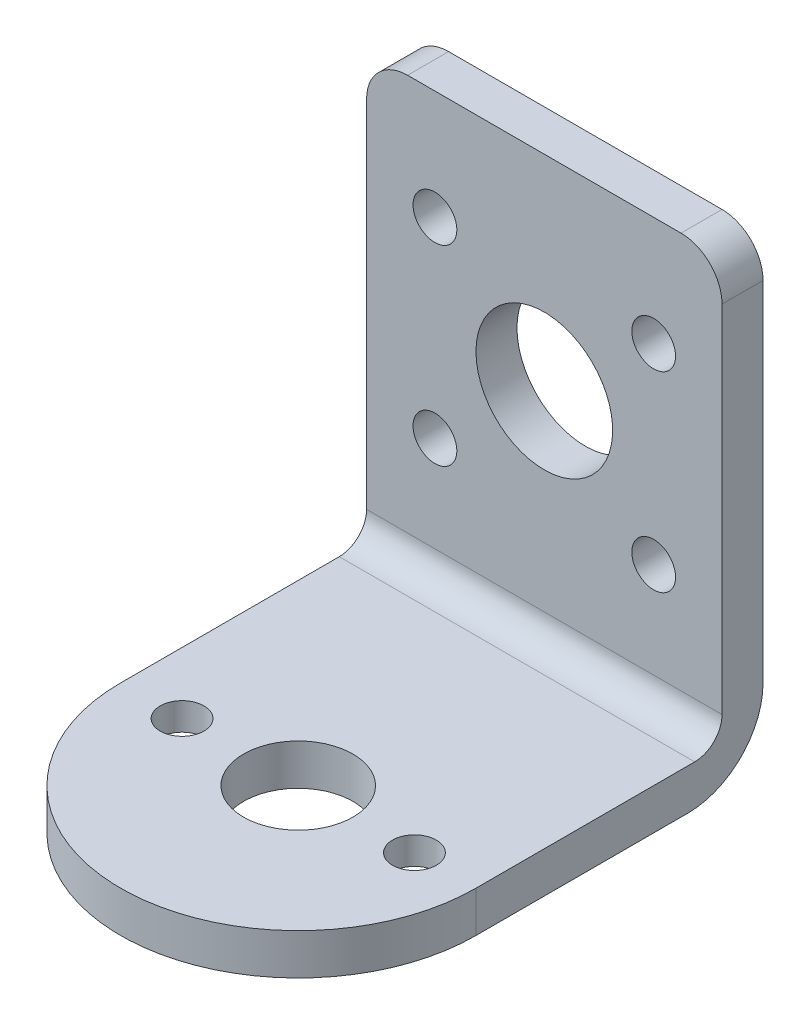
ISO-10303-21;
HEADER;
FILE_DESCRIPTION(('STEP AP214'),'2;1');
FILE_NAME('part.step','',(''),(''),'','','');
FILE_SCHEMA(('AUTOMOTIVE_DESIGN { 1 0 10303 214 1 1 1 1 }'));
ENDSEC;
DATA;
#1=APPLICATION_CONTEXT('core data for automotive mechanical design processes');
#2=APPLICATION_PROTOCOL_DEFINITION('international standard','automotive_design',2000,#1);
#3=PRODUCT_CONTEXT('',#1,'mechanical');
#4=PRODUCT('Part','Part','',(#3));
#5=PRODUCT_RELATED_PRODUCT_CATEGORY('part','',(#4));
#6=PRODUCT_DEFINITION_FORMATION('','',#4);
#7=PRODUCT_DEFINITION_CONTEXT('part definition',#1,'design');
#8=PRODUCT_DEFINITION('design','',#6,#7);
#9=PRODUCT_DEFINITION_SHAPE('','',#8);
#10=(LENGTH_UNIT() NAMED_UNIT(*) SI_UNIT(.MILLI.,.METRE.));
#11=(NAMED_UNIT(*) PLANE_ANGLE_UNIT() SI_UNIT($,.RADIAN.));
#12=(NAMED_UNIT(*) SI_UNIT($,.STERADIAN.) SOLID_ANGLE_UNIT());
#13=UNCERTAINTY_MEASURE_WITH_UNIT(LENGTH_MEASURE(1.E-05),#10,'distance_accuracy_value','');
#14=(GEOMETRIC_REPRESENTATION_CONTEXT(3) GLOBAL_UNCERTAINTY_ASSIGNED_CONTEXT((#13)) GLOBAL_UNIT_ASSIGNED_CONTEXT((#10,
#11,#12)) REPRESENTATION_CONTEXT('',''));
#15=CARTESIAN_POINT('',(0.,0.,0.));
#16=DIRECTION('',(0.,0.,1.));
#17=DIRECTION('',(1.,0.,0.));
#18=AXIS2_PLACEMENT_3D('',#15,#16,#17);
#19=CARTESIAN_POINT('',(0.,3.,0.));
#20=DIRECTION('',(0.,-1.,0.));
#21=DIRECTION('',(0.,0.,-1.));
#22=AXIS2_PLACEMENT_3D('',#19,#20,#21);
#23=CYLINDRICAL_SURFACE('',#22,13.);
#24=CARTESIAN_POINT('',(0.,0.,0.));
#25=DIRECTION('',(0.,1.,0.));
#26=DIRECTION('',(0.,0.,1.));
#27=AXIS2_PLACEMENT_3D('',#24,#25,#26);
#28=CIRCLE('',#27,13.);
#29=CARTESIAN_POINT('',(-13.,0.,0.));
#30=VERTEX_POINT('',#29);
#31=CARTESIAN_POINT('',(13.,0.,0.));
#32=VERTEX_POINT('',#31);
#33=EDGE_CURVE('E152',#30,#32,#28,.T.);
#34=ORIENTED_EDGE('',*,*,#33,.T.);
#35=DIRECTION('',(0.,-1.,0.));
#36=VECTOR('',#35,1.);
#37=CARTESIAN_POINT('',(13.,3.,0.));
#38=LINE('',#37,#36);
#39=CARTESIAN_POINT('',(13.,3.,0.));
#40=VERTEX_POINT('',#39);
#41=EDGE_CURVE('E132',#40,#32,#38,.T.);
#42=ORIENTED_EDGE('',*,*,#41,.F.);
#43=CARTESIAN_POINT('',(0.,3.,0.));
#44=DIRECTION('',(0.,1.,0.));
#45=DIRECTION('',(0.,0.,1.));
#46=AXIS2_PLACEMENT_3D('',#43,#44,#45);
#47=CIRCLE('',#46,13.);
#48=CARTESIAN_POINT('',(-13.,3.,0.));
#49=VERTEX_POINT('',#48);
#50=EDGE_CURVE('E140',#49,#40,#47,.T.);
#51=ORIENTED_EDGE('',*,*,#50,.F.);
#52=DIRECTION('',(0.,-1.,0.));
#53=VECTOR('',#52,1.);
#54=CARTESIAN_POINT('',(-13.,3.,0.));
#55=LINE('',#54,#53);
#56=EDGE_CURVE('E286',#49,#30,#55,.T.);
#57=ORIENTED_EDGE('',*,*,#56,.T.);
#58=EDGE_LOOP('',(#34,#42,#51,#57));
#59=FACE_BOUND('',#58,.T.);
#60=ADVANCED_FACE('F47',(#59),#23,.T.);
#61=CARTESIAN_POINT('',(13.,3.,0.));
#62=DIRECTION('',(-1.,0.,0.));
#63=DIRECTION('',(0.,0.,1.));
#64=AXIS2_PLACEMENT_3D('',#61,#62,#63);
#65=PLANE('',#64);
#66=DIRECTION('',(0.,-1.,0.));
#67=VECTOR('',#66,1.);
#68=CARTESIAN_POINT('',(13.,3.,-21.));
#69=LINE('',#68,#67);
#70=CARTESIAN_POINT('',(13.,31.,-21.));
#71=VERTEX_POINT('',#70);
#72=CARTESIAN_POINT('',(13.,5.5,-21.));
#73=VERTEX_POINT('',#72);
#74=EDGE_CURVE('E155',#71,#73,#69,.T.);
#75=ORIENTED_EDGE('',*,*,#74,.F.);
#76=DIRECTION('',(0.,0.,-1.));
#77=VECTOR('',#76,1.);
#78=CARTESIAN_POINT('',(13.,31.,-18.));
#79=LINE('',#78,#77);
#80=CARTESIAN_POINT('',(13.,31.,-18.));
#81=VERTEX_POINT('',#80);
#82=EDGE_CURVE('E237',#71,#81,#79,.F.);
#83=ORIENTED_EDGE('',*,*,#82,.T.);
#84=DIRECTION('',(0.,-1.,0.));
#85=VECTOR('',#84,1.);
#86=CARTESIAN_POINT('',(13.,34.,-18.));
#87=LINE('',#86,#85);
#88=CARTESIAN_POINT('',(13.,5.,-18.));
#89=VERTEX_POINT('',#88);
#90=EDGE_CURVE('E337',#81,#89,#87,.T.);
#91=ORIENTED_EDGE('',*,*,#90,.T.);
#92=CARTESIAN_POINT('',(13.,5.,-16.));
#93=DIRECTION('',(-1.,0.,0.));
#94=DIRECTION('',(0.,0.,1.));
#95=AXIS2_PLACEMENT_3D('',#92,#93,#94);
#96=CIRCLE('',#95,2.);
#97=CARTESIAN_POINT('',(13.,3.,-16.));
#98=VERTEX_POINT('',#97);
#99=EDGE_CURVE('E135',#89,#98,#96,.T.);
#100=ORIENTED_EDGE('',*,*,#99,.T.);
#101=DIRECTION('',(0.,0.,-1.));
#102=VECTOR('',#101,1.);
#103=CARTESIAN_POINT('',(13.,3.,0.));
#104=LINE('',#103,#102);
#105=EDGE_CURVE('E127',#40,#98,#104,.T.);
#106=ORIENTED_EDGE('',*,*,#105,.F.);
#107=ORIENTED_EDGE('',*,*,#41,.T.);
#108=DIRECTION('',(0.,0.,-1.));
#109=VECTOR('',#108,1.);
#110=CARTESIAN_POINT('',(13.,0.,0.));
#111=LINE('',#110,#109);
#112=CARTESIAN_POINT('',(13.,0.,-15.5));
#113=VERTEX_POINT('',#112);
#114=EDGE_CURVE('E273',#32,#113,#111,.T.);
#115=ORIENTED_EDGE('',*,*,#114,.T.);
#116=CARTESIAN_POINT('',(13.,5.5,-15.5));
#117=DIRECTION('',(-1.,0.,0.));
#118=DIRECTION('',(0.,0.,1.));
#119=AXIS2_PLACEMENT_3D('',#116,#117,#118);
#120=CIRCLE('',#119,5.5);
#121=EDGE_CURVE('E183',#113,#73,#120,.F.);
#122=ORIENTED_EDGE('',*,*,#121,.T.);
#123=EDGE_LOOP('',(#75,#83,#91,#100,#106,#107,#115,#122));
#124=FACE_BOUND('',#123,.T.);
#125=ADVANCED_FACE('F129',(#124),#65,.F.);
#126=CARTESIAN_POINT('',(0.,3.,-21.));
#127=DIRECTION('',(0.,0.,-1.));
#128=DIRECTION('',(-1.,0.,0.));
#129=AXIS2_PLACEMENT_3D('',#126,#127,#128);
#130=PLANE('',#129);
#131=CARTESIAN_POINT('',(-8.,12.,-21.));
#132=DIRECTION('',(0.,0.,-1.));
#133=DIRECTION('',(-1.,0.,0.));
#134=AXIS2_PLACEMENT_3D('',#131,#132,#133);
#135=CIRCLE('',#134,1.6);
#136=CARTESIAN_POINT('',(-9.6,12.,-21.));
#137=VERTEX_POINT('',#136);
#138=EDGE_CURVE('E430',#137,#137,#135,.T.);
#139=ORIENTED_EDGE('',*,*,#138,.F.);
#140=EDGE_LOOP('',(#139));
#141=FACE_BOUND('',#140,.T.);
#142=CARTESIAN_POINT('',(8.,12.,-21.));
#143=DIRECTION('',(0.,0.,-1.));
#144=DIRECTION('',(-1.,0.,0.));
#145=AXIS2_PLACEMENT_3D('',#142,#143,#144);
#146=CIRCLE('',#145,1.6);
#147=CARTESIAN_POINT('',(6.4,12.,-21.));
#148=VERTEX_POINT('',#147);
#149=EDGE_CURVE('E425',#148,#148,#146,.T.);
#150=ORIENTED_EDGE('',*,*,#149,.F.);
#151=EDGE_LOOP('',(#150));
#152=FACE_BOUND('',#151,.T.);
#153=CARTESIAN_POINT('',(-8.,26.,-21.));
#154=DIRECTION('',(0.,0.,-1.));
#155=DIRECTION('',(-1.,0.,0.));
#156=AXIS2_PLACEMENT_3D('',#153,#154,#155);
#157=CIRCLE('',#156,1.6);
#158=CARTESIAN_POINT('',(-9.6,26.,-21.));
#159=VERTEX_POINT('',#158);
#160=EDGE_CURVE('E419',#159,#159,#157,.T.);
#161=ORIENTED_EDGE('',*,*,#160,.F.);
#162=EDGE_LOOP('',(#161));
#163=FACE_BOUND('',#162,.T.);
#164=CARTESIAN_POINT('',(8.,26.,-21.));
#165=DIRECTION('',(0.,0.,-1.));
#166=DIRECTION('',(-1.,0.,0.));
#167=AXIS2_PLACEMENT_3D('',#164,#165,#166);
#168=CIRCLE('',#167,1.6);
#169=CARTESIAN_POINT('',(6.4,26.,-21.));
#170=VERTEX_POINT('',#169);
#171=EDGE_CURVE('E411',#170,#170,#168,.T.);
#172=ORIENTED_EDGE('',*,*,#171,.F.);
#173=EDGE_LOOP('',(#172));
#174=FACE_BOUND('',#173,.T.);
#175=CARTESIAN_POINT('',(0.,19.,-21.));
#176=DIRECTION('',(0.,0.,-1.));
#177=DIRECTION('',(-1.,0.,0.));
#178=AXIS2_PLACEMENT_3D('',#175,#176,#177);
#179=CIRCLE('',#178,5.);
#180=CARTESIAN_POINT('',(-5.,19.,-21.));
#181=VERTEX_POINT('',#180);
#182=EDGE_CURVE('E200',#181,#181,#179,.T.);
#183=ORIENTED_EDGE('',*,*,#182,.F.);
#184=EDGE_LOOP('',(#183));
#185=FACE_BOUND('',#184,.T.);
#186=DIRECTION('',(0.,-1.,0.));
#187=VECTOR('',#186,1.);
#188=CARTESIAN_POINT('',(-13.,3.,-21.));
#189=LINE('',#188,#187);
#190=CARTESIAN_POINT('',(-13.,31.,-21.));
#191=VERTEX_POINT('',#190);
#192=CARTESIAN_POINT('',(-13.,5.5,-21.));
#193=VERTEX_POINT('',#192);
#194=EDGE_CURVE('E162',#191,#193,#189,.T.);
#195=ORIENTED_EDGE('',*,*,#194,.F.);
#196=CARTESIAN_POINT('',(-10.,31.,-21.));
#197=DIRECTION('',(0.,0.,-1.));
#198=DIRECTION('',(-1.,0.,0.));
#199=AXIS2_PLACEMENT_3D('',#196,#197,#198);
#200=CIRCLE('',#199,3.);
#201=CARTESIAN_POINT('',(-10.,34.,-21.));
#202=VERTEX_POINT('',#201);
#203=EDGE_CURVE('E234',#191,#202,#200,.T.);
#204=ORIENTED_EDGE('',*,*,#203,.T.);
#205=DIRECTION('',(-1.,0.,0.));
#206=VECTOR('',#205,1.);
#207=CARTESIAN_POINT('',(-13.,34.,-21.));
#208=LINE('',#207,#206);
#209=CARTESIAN_POINT('',(10.,34.,-21.));
#210=VERTEX_POINT('',#209);
#211=EDGE_CURVE('E342',#210,#202,#208,.T.);
#212=ORIENTED_EDGE('',*,*,#211,.F.);
#213=CARTESIAN_POINT('',(10.,31.,-21.));
#214=DIRECTION('',(0.,0.,-1.));
#215=DIRECTION('',(-1.,0.,0.));
#216=AXIS2_PLACEMENT_3D('',#213,#214,#215);
#217=CIRCLE('',#216,3.);
#218=EDGE_CURVE('E64',#210,#71,#217,.T.);
#219=ORIENTED_EDGE('',*,*,#218,.T.);
#220=ORIENTED_EDGE('',*,*,#74,.T.);
#221=DIRECTION('',(1.,0.,0.));
#222=VECTOR('',#221,1.);
#223=CARTESIAN_POINT('',(-13.,5.5,-21.));
#224=LINE('',#223,#222);
#225=EDGE_CURVE('E187',#73,#193,#224,.F.);
#226=ORIENTED_EDGE('',*,*,#225,.T.);
#227=EDGE_LOOP('',(#195,#204,#212,#219,#220,#226));
#228=FACE_BOUND('',#227,.T.);
#229=ADVANCED_FACE('F291',(#141,#152,#163,#174,#185,#228),#130,.T.);
#230=CARTESIAN_POINT('',(-13.,3.,0.));
#231=DIRECTION('',(-1.,0.,0.));
#232=DIRECTION('',(0.,0.,1.));
#233=AXIS2_PLACEMENT_3D('',#230,#231,#232);
#234=PLANE('',#233);
#235=DIRECTION('',(0.,-1.,0.));
#236=VECTOR('',#235,1.);
#237=CARTESIAN_POINT('',(-13.,34.,-18.));
#238=LINE('',#237,#236);
#239=CARTESIAN_POINT('',(-13.,31.,-18.));
#240=VERTEX_POINT('',#239);
#241=CARTESIAN_POINT('',(-13.,5.,-18.));
#242=VERTEX_POINT('',#241);
#243=EDGE_CURVE('E351',#240,#242,#238,.T.);
#244=ORIENTED_EDGE('',*,*,#243,.F.);
#245=DIRECTION('',(0.,0.,1.));
#246=VECTOR('',#245,1.);
#247=CARTESIAN_POINT('',(-13.,31.,0.));
#248=LINE('',#247,#246);
#249=EDGE_CURVE('E72',#240,#191,#248,.F.);
#250=ORIENTED_EDGE('',*,*,#249,.T.);
#251=ORIENTED_EDGE('',*,*,#194,.T.);
#252=CARTESIAN_POINT('',(-13.,5.5,-15.5));
#253=DIRECTION('',(-1.,0.,0.));
#254=DIRECTION('',(0.,0.,1.));
#255=AXIS2_PLACEMENT_3D('',#252,#253,#254);
#256=CIRCLE('',#255,5.5);
#257=CARTESIAN_POINT('',(-13.,0.,-15.5));
#258=VERTEX_POINT('',#257);
#259=EDGE_CURVE('E191',#193,#258,#256,.T.);
#260=ORIENTED_EDGE('',*,*,#259,.T.);
#261=DIRECTION('',(0.,0.,-1.));
#262=VECTOR('',#261,1.);
#263=CARTESIAN_POINT('',(-13.,0.,0.));
#264=LINE('',#263,#262);
#265=EDGE_CURVE('E149',#30,#258,#264,.T.);
#266=ORIENTED_EDGE('',*,*,#265,.F.);
#267=ORIENTED_EDGE('',*,*,#56,.F.);
#268=DIRECTION('',(0.,0.,-1.));
#269=VECTOR('',#268,1.);
#270=CARTESIAN_POINT('',(-13.,3.,0.));
#271=LINE('',#270,#269);
#272=CARTESIAN_POINT('',(-13.,3.,-16.));
#273=VERTEX_POINT('',#272);
#274=EDGE_CURVE('E139',#49,#273,#271,.T.);
#275=ORIENTED_EDGE('',*,*,#274,.T.);
#276=CARTESIAN_POINT('',(-13.,5.,-16.));
#277=DIRECTION('',(-1.,0.,0.));
#278=DIRECTION('',(0.,0.,1.));
#279=AXIS2_PLACEMENT_3D('',#276,#277,#278);
#280=CIRCLE('',#279,2.);
#281=EDGE_CURVE('E175',#273,#242,#280,.F.);
#282=ORIENTED_EDGE('',*,*,#281,.T.);
#283=EDGE_LOOP('',(#244,#250,#251,#260,#266,#267,#275,#282));
#284=FACE_BOUND('',#283,.T.);
#285=ADVANCED_FACE('F289',(#284),#234,.T.);
#286=CARTESIAN_POINT('',(0.,3.,0.));
#287=DIRECTION('',(0.,1.,0.));
#288=DIRECTION('',(0.,0.,1.));
#289=AXIS2_PLACEMENT_3D('',#286,#287,#288);
#290=PLANE('',#289);
#291=ORIENTED_EDGE('',*,*,#105,.T.);
#292=DIRECTION('',(1.,0.,0.));
#293=VECTOR('',#292,1.);
#294=CARTESIAN_POINT('',(0.,3.,-16.));
#295=LINE('',#294,#293);
#296=EDGE_CURVE('E160',#98,#273,#295,.F.);
#297=ORIENTED_EDGE('',*,*,#296,.T.);
#298=ORIENTED_EDGE('',*,*,#274,.F.);
#299=ORIENTED_EDGE('',*,*,#50,.T.);
#300=EDGE_LOOP('',(#291,#297,#298,#299));
#301=FACE_BOUND('',#300,.T.);
#302=CARTESIAN_POINT('',(8.5,3.,0.));
#303=DIRECTION('',(0.,1.,0.));
#304=DIRECTION('',(0.,0.,1.));
#305=AXIS2_PLACEMENT_3D('',#302,#303,#304);
#306=CIRCLE('',#305,1.6);
#307=CARTESIAN_POINT('',(8.5,3.,1.6));
#308=VERTEX_POINT('',#307);
#309=EDGE_CURVE('E354',#308,#308,#306,.T.);
#310=ORIENTED_EDGE('',*,*,#309,.F.);
#311=EDGE_LOOP('',(#310));
#312=FACE_BOUND('',#311,.T.);
#313=CARTESIAN_POINT('',(-8.5,3.,0.));
#314=DIRECTION('',(0.,1.,0.));
#315=DIRECTION('',(0.,0.,1.));
#316=AXIS2_PLACEMENT_3D('',#313,#314,#315);
#317=CIRCLE('',#316,1.6);
#318=CARTESIAN_POINT('',(-8.5,3.,1.6));
#319=VERTEX_POINT('',#318);
#320=EDGE_CURVE('E355',#319,#319,#317,.T.);
#321=ORIENTED_EDGE('',*,*,#320,.F.);
#322=EDGE_LOOP('',(#321));
#323=FACE_BOUND('',#322,.T.);
#324=CARTESIAN_POINT('',(0.,3.,0.));
#325=DIRECTION('',(0.,1.,0.));
#326=DIRECTION('',(0.,0.,1.));
#327=AXIS2_PLACEMENT_3D('',#324,#325,#326);
#328=CIRCLE('',#327,4.);
#329=CARTESIAN_POINT('',(0.,3.,4.));
#330=VERTEX_POINT('',#329);
#331=EDGE_CURVE('E169',#330,#330,#328,.T.);
#332=ORIENTED_EDGE('',*,*,#331,.F.);
#333=EDGE_LOOP('',(#332));
#334=FACE_BOUND('',#333,.T.);
#335=ADVANCED_FACE('F144',(#301,#312,#323,#334),#290,.T.);
#336=CARTESIAN_POINT('',(0.,0.,0.));
#337=DIRECTION('',(0.,1.,0.));
#338=DIRECTION('',(0.,0.,1.));
#339=AXIS2_PLACEMENT_3D('',#336,#337,#338);
#340=PLANE('',#339);
#341=CARTESIAN_POINT('',(-8.5,0.,0.));
#342=DIRECTION('',(0.,1.,0.));
#343=DIRECTION('',(0.,0.,1.));
#344=AXIS2_PLACEMENT_3D('',#341,#342,#343);
#345=CIRCLE('',#344,3.33205080756889);
#346=CARTESIAN_POINT('',(-8.5,0.,3.33205080756889));
#347=VERTEX_POINT('',#346);
#348=EDGE_CURVE('E244',#347,#347,#345,.T.);
#349=ORIENTED_EDGE('',*,*,#348,.T.);
#350=EDGE_LOOP('',(#349));
#351=FACE_BOUND('',#350,.T.);
#352=CARTESIAN_POINT('',(8.5,0.,0.));
#353=DIRECTION('',(0.,1.,0.));
#354=DIRECTION('',(0.,0.,1.));
#355=AXIS2_PLACEMENT_3D('',#352,#353,#354);
#356=CIRCLE('',#355,3.33205080756889);
#357=CARTESIAN_POINT('',(8.5,0.,3.33205080756889));
#358=VERTEX_POINT('',#357);
#359=EDGE_CURVE('E240',#358,#358,#356,.T.);
#360=ORIENTED_EDGE('',*,*,#359,.T.);
#361=EDGE_LOOP('',(#360));
#362=FACE_BOUND('',#361,.T.);
#363=CARTESIAN_POINT('',(0.,0.,0.));
#364=DIRECTION('',(0.,1.,0.));
#365=DIRECTION('',(0.,0.,1.));
#366=AXIS2_PLACEMENT_3D('',#363,#364,#365);
#367=CIRCLE('',#366,4.);
#368=CARTESIAN_POINT('',(0.,0.,4.));
#369=VERTEX_POINT('',#368);
#370=EDGE_CURVE('E166',#369,#369,#367,.T.);
#371=ORIENTED_EDGE('',*,*,#370,.T.);
#372=EDGE_LOOP('',(#371));
#373=FACE_BOUND('',#372,.T.);
#374=ORIENTED_EDGE('',*,*,#265,.T.);
#375=DIRECTION('',(1.,0.,0.));
#376=VECTOR('',#375,1.);
#377=CARTESIAN_POINT('',(13.,0.,-15.5));
#378=LINE('',#377,#376);
#379=EDGE_CURVE('E179',#258,#113,#378,.T.);
#380=ORIENTED_EDGE('',*,*,#379,.T.);
#381=ORIENTED_EDGE('',*,*,#114,.F.);
#382=ORIENTED_EDGE('',*,*,#33,.F.);
#383=EDGE_LOOP('',(#374,#380,#381,#382));
#384=FACE_BOUND('',#383,.T.);
#385=ADVANCED_FACE('F260',(#351,#362,#373,#384),#340,.F.);
#386=CARTESIAN_POINT('',(0.,-2.,0.));
#387=DIRECTION('',(0.,1.,0.));
#388=DIRECTION('',(0.,0.,1.));
#389=AXIS2_PLACEMENT_3D('',#386,#387,#388);
#390=CYLINDRICAL_SURFACE('',#389,4.);
#391=ORIENTED_EDGE('',*,*,#331,.T.);
#392=EDGE_LOOP('',(#391));
#393=FACE_BOUND('',#392,.T.);
#394=ORIENTED_EDGE('',*,*,#370,.F.);
#395=EDGE_LOOP('',(#394));
#396=FACE_BOUND('',#395,.T.);
#397=ADVANCED_FACE('F263',(#393,#396),#390,.F.);
#398=CARTESIAN_POINT('',(-8.5,-2.,0.));
#399=DIRECTION('',(0.,1.,0.));
#400=DIRECTION('',(0.,0.,1.));
#401=AXIS2_PLACEMENT_3D('',#398,#399,#400);
#402=CYLINDRICAL_SURFACE('',#401,1.6);
#403=CARTESIAN_POINT('',(-8.5,1.00000000000001,0.));
#404=DIRECTION('',(0.,1.,0.));
#405=DIRECTION('',(0.,0.,1.));
#406=AXIS2_PLACEMENT_3D('',#403,#404,#405);
#407=CIRCLE('',#406,1.6);
#408=CARTESIAN_POINT('',(-8.5,1.00000000000001,1.6));
#409=VERTEX_POINT('',#408);
#410=EDGE_CURVE('E57',#409,#409,#407,.F.);
#411=ORIENTED_EDGE('',*,*,#410,.T.);
#412=EDGE_LOOP('',(#411));
#413=FACE_BOUND('',#412,.T.);
#414=ORIENTED_EDGE('',*,*,#320,.T.);
#415=EDGE_LOOP('',(#414));
#416=FACE_BOUND('',#415,.T.);
#417=ADVANCED_FACE('F251',(#413,#416),#402,.F.);
#418=CARTESIAN_POINT('',(8.5,-2.,0.));
#419=DIRECTION('',(0.,1.,0.));
#420=DIRECTION('',(0.,0.,1.));
#421=AXIS2_PLACEMENT_3D('',#418,#419,#420);
#422=CYLINDRICAL_SURFACE('',#421,1.6);
#423=CARTESIAN_POINT('',(8.5,1.00000000000001,0.));
#424=DIRECTION('',(0.,1.,0.));
#425=DIRECTION('',(0.,0.,1.));
#426=AXIS2_PLACEMENT_3D('',#423,#424,#425);
#427=CIRCLE('',#426,1.6);
#428=CARTESIAN_POINT('',(8.5,1.00000000000001,1.6));
#429=VERTEX_POINT('',#428);
#430=EDGE_CURVE('E11',#429,#429,#427,.F.);
#431=ORIENTED_EDGE('',*,*,#430,.T.);
#432=EDGE_LOOP('',(#431));
#433=FACE_BOUND('',#432,.T.);
#434=ORIENTED_EDGE('',*,*,#309,.T.);
#435=EDGE_LOOP('',(#434));
#436=FACE_BOUND('',#435,.T.);
#437=ADVANCED_FACE('F378',(#433,#436),#422,.F.);
#438=CARTESIAN_POINT('',(-13.,34.,-18.));
#439=DIRECTION('',(0.,0.,-1.));
#440=DIRECTION('',(-1.,0.,0.));
#441=AXIS2_PLACEMENT_3D('',#438,#439,#440);
#442=PLANE('',#441);
#443=CARTESIAN_POINT('',(-8.,12.,-18.));
#444=DIRECTION('',(0.,0.,-1.));
#445=DIRECTION('',(-1.,0.,0.));
#446=AXIS2_PLACEMENT_3D('',#443,#444,#445);
#447=CIRCLE('',#446,1.6);
#448=CARTESIAN_POINT('',(-9.6,12.,-18.));
#449=VERTEX_POINT('',#448);
#450=EDGE_CURVE('E212',#449,#449,#447,.T.);
#451=ORIENTED_EDGE('',*,*,#450,.T.);
#452=EDGE_LOOP('',(#451));
#453=FACE_BOUND('',#452,.T.);
#454=CARTESIAN_POINT('',(8.,12.,-18.));
#455=DIRECTION('',(0.,0.,-1.));
#456=DIRECTION('',(-1.,0.,0.));
#457=AXIS2_PLACEMENT_3D('',#454,#455,#456);
#458=CIRCLE('',#457,1.6);
#459=CARTESIAN_POINT('',(6.4,12.,-18.));
#460=VERTEX_POINT('',#459);
#461=EDGE_CURVE('E208',#460,#460,#458,.T.);
#462=ORIENTED_EDGE('',*,*,#461,.T.);
#463=EDGE_LOOP('',(#462));
#464=FACE_BOUND('',#463,.T.);
#465=CARTESIAN_POINT('',(-8.,26.,-18.));
#466=DIRECTION('',(0.,0.,-1.));
#467=DIRECTION('',(-1.,0.,0.));
#468=AXIS2_PLACEMENT_3D('',#465,#466,#467);
#469=CIRCLE('',#468,1.6);
#470=CARTESIAN_POINT('',(-9.6,26.,-18.));
#471=VERTEX_POINT('',#470);
#472=EDGE_CURVE('E204',#471,#471,#469,.T.);
#473=ORIENTED_EDGE('',*,*,#472,.T.);
#474=EDGE_LOOP('',(#473));
#475=FACE_BOUND('',#474,.T.);
#476=CARTESIAN_POINT('',(8.,26.,-18.));
#477=DIRECTION('',(0.,0.,-1.));
#478=DIRECTION('',(-1.,0.,0.));
#479=AXIS2_PLACEMENT_3D('',#476,#477,#478);
#480=CIRCLE('',#479,1.6);
#481=CARTESIAN_POINT('',(6.4,26.,-18.));
#482=VERTEX_POINT('',#481);
#483=EDGE_CURVE('E199',#482,#482,#480,.T.);
#484=ORIENTED_EDGE('',*,*,#483,.T.);
#485=EDGE_LOOP('',(#484));
#486=FACE_BOUND('',#485,.T.);
#487=CARTESIAN_POINT('',(0.,19.,-18.));
#488=DIRECTION('',(0.,0.,-1.));
#489=DIRECTION('',(-1.,0.,0.));
#490=AXIS2_PLACEMENT_3D('',#487,#488,#489);
#491=CIRCLE('',#490,5.);
#492=CARTESIAN_POINT('',(-5.,19.,-18.));
#493=VERTEX_POINT('',#492);
#494=EDGE_CURVE('E195',#493,#493,#491,.T.);
#495=ORIENTED_EDGE('',*,*,#494,.T.);
#496=EDGE_LOOP('',(#495));
#497=FACE_BOUND('',#496,.T.);
#498=DIRECTION('',(1.,0.,0.));
#499=VECTOR('',#498,1.);
#500=CARTESIAN_POINT('',(-13.,34.,-18.));
#501=LINE('',#500,#499);
#502=CARTESIAN_POINT('',(-10.,34.,-18.));
#503=VERTEX_POINT('',#502);
#504=CARTESIAN_POINT('',(10.,34.,-18.));
#505=VERTEX_POINT('',#504);
#506=EDGE_CURVE('E216',#503,#505,#501,.T.);
#507=ORIENTED_EDGE('',*,*,#506,.F.);
#508=CARTESIAN_POINT('',(-10.,31.,-18.));
#509=DIRECTION('',(0.,0.,-1.));
#510=DIRECTION('',(-1.,0.,0.));
#511=AXIS2_PLACEMENT_3D('',#508,#509,#510);
#512=CIRCLE('',#511,3.);
#513=EDGE_CURVE('E227',#503,#240,#512,.F.);
#514=ORIENTED_EDGE('',*,*,#513,.T.);
#515=ORIENTED_EDGE('',*,*,#243,.T.);
#516=DIRECTION('',(1.,0.,0.));
#517=VECTOR('',#516,1.);
#518=CARTESIAN_POINT('',(-13.,5.,-18.));
#519=LINE('',#518,#517);
#520=EDGE_CURVE('E154',#242,#89,#519,.T.);
#521=ORIENTED_EDGE('',*,*,#520,.T.);
#522=ORIENTED_EDGE('',*,*,#90,.F.);
#523=CARTESIAN_POINT('',(10.,31.,-18.));
#524=DIRECTION('',(0.,0.,-1.));
#525=DIRECTION('',(-1.,0.,0.));
#526=AXIS2_PLACEMENT_3D('',#523,#524,#525);
#527=CIRCLE('',#526,3.);
#528=EDGE_CURVE('E224',#81,#505,#527,.F.);
#529=ORIENTED_EDGE('',*,*,#528,.T.);
#530=EDGE_LOOP('',(#507,#514,#515,#521,#522,#529));
#531=FACE_BOUND('',#530,.T.);
#532=ADVANCED_FACE('F336',(#453,#464,#475,#486,#497,#531),#442,.F.);
#533=CARTESIAN_POINT('',(0.,34.,0.));
#534=DIRECTION('',(0.,1.,0.));
#535=DIRECTION('',(0.,0.,1.));
#536=AXIS2_PLACEMENT_3D('',#533,#534,#535);
#537=PLANE('',#536);
#538=ORIENTED_EDGE('',*,*,#211,.T.);
#539=DIRECTION('',(0.,0.,1.));
#540=VECTOR('',#539,1.);
#541=CARTESIAN_POINT('',(-10.,34.,0.));
#542=LINE('',#541,#540);
#543=EDGE_CURVE('E220',#202,#503,#542,.T.);
#544=ORIENTED_EDGE('',*,*,#543,.T.);
#545=ORIENTED_EDGE('',*,*,#506,.T.);
#546=DIRECTION('',(0.,0.,-1.));
#547=VECTOR('',#546,1.);
#548=CARTESIAN_POINT('',(10.,34.,-21.));
#549=LINE('',#548,#547);
#550=EDGE_CURVE('E194',#505,#210,#549,.T.);
#551=ORIENTED_EDGE('',*,*,#550,.T.);
#552=EDGE_LOOP('',(#538,#544,#545,#551));
#553=FACE_BOUND('',#552,.T.);
#554=ADVANCED_FACE('F311',(#553),#537,.T.);
#555=CARTESIAN_POINT('',(-13.,5.,-16.));
#556=DIRECTION('',(1.,0.,0.));
#557=DIRECTION('',(0.,0.,-1.));
#558=AXIS2_PLACEMENT_3D('',#555,#556,#557);
#559=CYLINDRICAL_SURFACE('',#558,2.);
#560=ORIENTED_EDGE('',*,*,#281,.F.);
#561=ORIENTED_EDGE('',*,*,#296,.F.);
#562=ORIENTED_EDGE('',*,*,#99,.F.);
#563=ORIENTED_EDGE('',*,*,#520,.F.);
#564=EDGE_LOOP('',(#560,#561,#562,#563));
#565=FACE_BOUND('',#564,.T.);
#566=ADVANCED_FACE('F308',(#565),#559,.F.);
#567=CARTESIAN_POINT('',(0.,5.5,-15.5));
#568=DIRECTION('',(-1.,0.,0.));
#569=DIRECTION('',(0.,0.,1.));
#570=AXIS2_PLACEMENT_3D('',#567,#568,#569);
#571=CYLINDRICAL_SURFACE('',#570,5.5);
#572=ORIENTED_EDGE('',*,*,#259,.F.);
#573=ORIENTED_EDGE('',*,*,#225,.F.);
#574=ORIENTED_EDGE('',*,*,#121,.F.);
#575=ORIENTED_EDGE('',*,*,#379,.F.);
#576=EDGE_LOOP('',(#572,#573,#574,#575));
#577=FACE_BOUND('',#576,.T.);
#578=ADVANCED_FACE('F277',(#577),#571,.T.);
#579=CARTESIAN_POINT('',(0.,19.,9.99999999999999));
#580=DIRECTION('',(0.,0.,-1.));
#581=DIRECTION('',(-1.,0.,0.));
#582=AXIS2_PLACEMENT_3D('',#579,#580,#581);
#583=CYLINDRICAL_SURFACE('',#582,5.);
#584=ORIENTED_EDGE('',*,*,#182,.T.);
#585=EDGE_LOOP('',(#584));
#586=FACE_BOUND('',#585,.T.);
#587=ORIENTED_EDGE('',*,*,#494,.F.);
#588=EDGE_LOOP('',(#587));
#589=FACE_BOUND('',#588,.T.);
#590=ADVANCED_FACE('F315',(#586,#589),#583,.F.);
#591=CARTESIAN_POINT('',(8.,26.,9.99999999999999));
#592=DIRECTION('',(0.,0.,-1.));
#593=DIRECTION('',(-1.,0.,0.));
#594=AXIS2_PLACEMENT_3D('',#591,#592,#593);
#595=CYLINDRICAL_SURFACE('',#594,1.6);
#596=ORIENTED_EDGE('',*,*,#171,.T.);
#597=EDGE_LOOP('',(#596));
#598=FACE_BOUND('',#597,.T.);
#599=ORIENTED_EDGE('',*,*,#483,.F.);
#600=EDGE_LOOP('',(#599));
#601=FACE_BOUND('',#600,.T.);
#602=ADVANCED_FACE('F391',(#598,#601),#595,.F.);
#603=CARTESIAN_POINT('',(-8.,26.,9.99999999999999));
#604=DIRECTION('',(0.,0.,-1.));
#605=DIRECTION('',(-1.,0.,0.));
#606=AXIS2_PLACEMENT_3D('',#603,#604,#605);
#607=CYLINDRICAL_SURFACE('',#606,1.6);
#608=ORIENTED_EDGE('',*,*,#160,.T.);
#609=EDGE_LOOP('',(#608));
#610=FACE_BOUND('',#609,.T.);
#611=ORIENTED_EDGE('',*,*,#472,.F.);
#612=EDGE_LOOP('',(#611));
#613=FACE_BOUND('',#612,.T.);
#614=ADVANCED_FACE('F399',(#610,#613),#607,.F.);
#615=CARTESIAN_POINT('',(8.,12.,9.99999999999999));
#616=DIRECTION('',(0.,0.,-1.));
#617=DIRECTION('',(-1.,0.,0.));
#618=AXIS2_PLACEMENT_3D('',#615,#616,#617);
#619=CYLINDRICAL_SURFACE('',#618,1.6);
#620=ORIENTED_EDGE('',*,*,#149,.T.);
#621=EDGE_LOOP('',(#620));
#622=FACE_BOUND('',#621,.T.);
#623=ORIENTED_EDGE('',*,*,#461,.F.);
#624=EDGE_LOOP('',(#623));
#625=FACE_BOUND('',#624,.T.);
#626=ADVANCED_FACE('F395',(#622,#625),#619,.F.);
#627=CARTESIAN_POINT('',(-8.,12.,9.99999999999999));
#628=DIRECTION('',(0.,0.,-1.));
#629=DIRECTION('',(-1.,0.,0.));
#630=AXIS2_PLACEMENT_3D('',#627,#628,#629);
#631=CYLINDRICAL_SURFACE('',#630,1.6);
#632=ORIENTED_EDGE('',*,*,#138,.T.);
#633=EDGE_LOOP('',(#632));
#634=FACE_BOUND('',#633,.T.);
#635=ORIENTED_EDGE('',*,*,#450,.F.);
#636=EDGE_LOOP('',(#635));
#637=FACE_BOUND('',#636,.T.);
#638=ADVANCED_FACE('F319',(#634,#637),#631,.F.);
#639=CARTESIAN_POINT('',(-10.,31.,0.));
#640=DIRECTION('',(0.,0.,1.));
#641=DIRECTION('',(1.,0.,0.));
#642=AXIS2_PLACEMENT_3D('',#639,#640,#641);
#643=CYLINDRICAL_SURFACE('',#642,3.);
#644=ORIENTED_EDGE('',*,*,#203,.F.);
#645=ORIENTED_EDGE('',*,*,#249,.F.);
#646=ORIENTED_EDGE('',*,*,#513,.F.);
#647=ORIENTED_EDGE('',*,*,#543,.F.);
#648=EDGE_LOOP('',(#644,#645,#646,#647));
#649=FACE_BOUND('',#648,.T.);
#650=ADVANCED_FACE('F316',(#649),#643,.T.);
#651=CARTESIAN_POINT('',(10.,31.,0.));
#652=DIRECTION('',(0.,0.,1.));
#653=DIRECTION('',(1.,0.,0.));
#654=AXIS2_PLACEMENT_3D('',#651,#652,#653);
#655=CYLINDRICAL_SURFACE('',#654,3.);
#656=ORIENTED_EDGE('',*,*,#528,.F.);
#657=ORIENTED_EDGE('',*,*,#82,.F.);
#658=ORIENTED_EDGE('',*,*,#218,.F.);
#659=ORIENTED_EDGE('',*,*,#550,.F.);
#660=EDGE_LOOP('',(#656,#657,#658,#659));
#661=FACE_BOUND('',#660,.T.);
#662=ADVANCED_FACE('F257',(#661),#655,.T.);
#663=CARTESIAN_POINT('',(-8.5,0.,0.));
#664=DIRECTION('',(0.,-1.,0.));
#665=DIRECTION('',(0.,0.,-1.));
#666=AXIS2_PLACEMENT_3D('',#663,#664,#665);
#667=CONICAL_SURFACE('',#666,3.33205080756889,1.0471975511966);
#668=ORIENTED_EDGE('',*,*,#410,.F.);
#669=EDGE_LOOP('',(#668));
#670=FACE_BOUND('',#669,.T.);
#671=ORIENTED_EDGE('',*,*,#348,.F.);
#672=EDGE_LOOP('',(#671));
#673=FACE_BOUND('',#672,.T.);
#674=ADVANCED_FACE('F254',(#670,#673),#667,.F.);
#675=CARTESIAN_POINT('',(8.5,0.,0.));
#676=DIRECTION('',(0.,-1.,0.));
#677=DIRECTION('',(0.,0.,-1.));
#678=AXIS2_PLACEMENT_3D('',#675,#676,#677);
#679=CONICAL_SURFACE('',#678,3.33205080756889,1.0471975511966);
#680=ORIENTED_EDGE('',*,*,#430,.F.);
#681=EDGE_LOOP('',(#680));
#682=FACE_BOUND('',#681,.T.);
#683=ORIENTED_EDGE('',*,*,#359,.F.);
#684=EDGE_LOOP('',(#683));
#685=FACE_BOUND('',#684,.T.);
#686=ADVANCED_FACE('F50',(#682,#685),#679,.F.);
#687=CLOSED_SHELL('',(#60,#125,#229,#285,#335,#385,#397,#417,#437,#532,#554,#566,#578,#590,#602,
#614,#626,#638,#650,#662,#674,#686));
#688=MANIFOLD_SOLID_BREP('B2',#687);
#689=ADVANCED_BREP_SHAPE_REPRESENTATION('',(#18,#688),#14);
#690=SHAPE_DEFINITION_REPRESENTATION(#9,#689);
ENDSEC;
END-ISO-10303-21;
